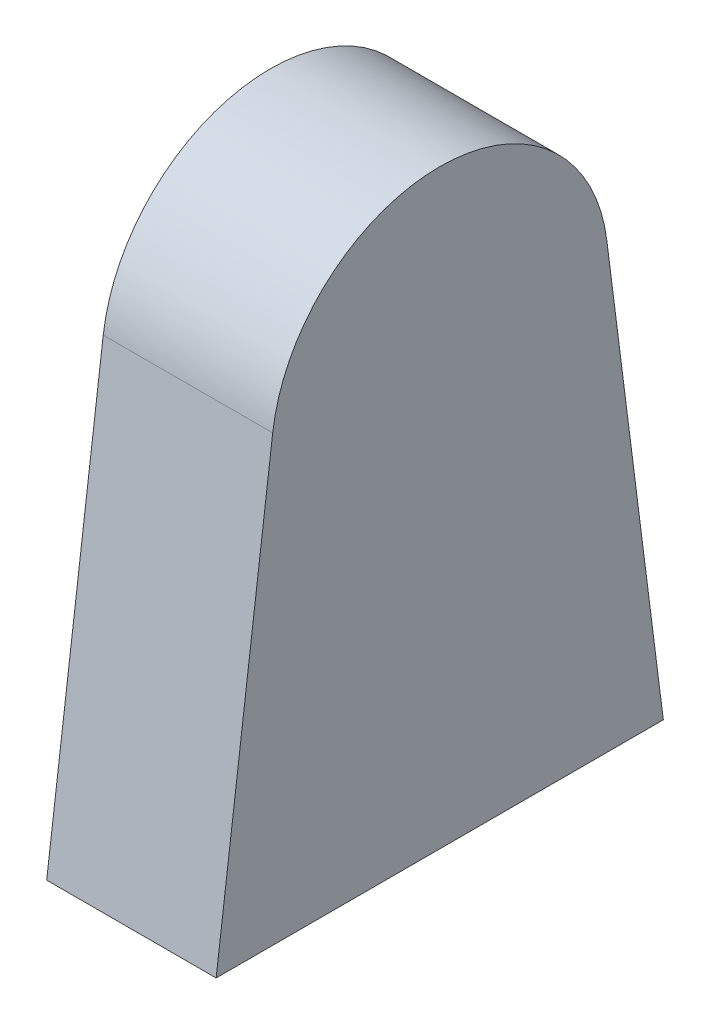
ISO-10303-21;
HEADER;
FILE_DESCRIPTION(('STEP AP214'),'2;1');
FILE_NAME('part.step','',(''),(''),'','','');
FILE_SCHEMA(('AUTOMOTIVE_DESIGN { 1 0 10303 214 1 1 1 1 }'));
ENDSEC;
DATA;
#1=APPLICATION_CONTEXT('core data for automotive mechanical design processes');
#2=APPLICATION_PROTOCOL_DEFINITION('international standard','automotive_design',2000,#1);
#3=PRODUCT_CONTEXT('',#1,'mechanical');
#4=PRODUCT('Part','Part','',(#3));
#5=PRODUCT_RELATED_PRODUCT_CATEGORY('part','',(#4));
#6=PRODUCT_DEFINITION_FORMATION('','',#4);
#7=PRODUCT_DEFINITION_CONTEXT('part definition',#1,'design');
#8=PRODUCT_DEFINITION('design','',#6,#7);
#9=PRODUCT_DEFINITION_SHAPE('','',#8);
#10=(LENGTH_UNIT() NAMED_UNIT(*) SI_UNIT(.MILLI.,.METRE.));
#11=(NAMED_UNIT(*) PLANE_ANGLE_UNIT() SI_UNIT($,.RADIAN.));
#12=(NAMED_UNIT(*) SI_UNIT($,.STERADIAN.) SOLID_ANGLE_UNIT());
#13=UNCERTAINTY_MEASURE_WITH_UNIT(LENGTH_MEASURE(1.E-05),#10,'distance_accuracy_value','');
#14=(GEOMETRIC_REPRESENTATION_CONTEXT(3) GLOBAL_UNCERTAINTY_ASSIGNED_CONTEXT((#13)) GLOBAL_UNIT_ASSIGNED_CONTEXT((#10,
#11,#12)) REPRESENTATION_CONTEXT('',''));
#15=CARTESIAN_POINT('',(0.,0.,0.));
#16=DIRECTION('',(0.,0.,1.));
#17=DIRECTION('',(1.,0.,0.));
#18=AXIS2_PLACEMENT_3D('',#15,#16,#17);
#19=CARTESIAN_POINT('',(1.,0.,-3.95808696063981));
#20=DIRECTION('',(0.,-0.126411308106956,0.991977913656694));
#21=DIRECTION('',(0.,-0.991977913656694,-0.126411308106956));
#22=AXIS2_PLACEMENT_3D('',#19,#20,#21);
#23=PLANE('',#22);
#24=DIRECTION('',(-1.,0.,0.));
#25=VECTOR('',#24,1.);
#26=CARTESIAN_POINT('',(1.,0.,-3.95808696063981));
#27=LINE('',#26,#25);
#28=CARTESIAN_POINT('',(1.5,0.,-3.95808696063981));
#29=VERTEX_POINT('',#28);
#30=CARTESIAN_POINT('',(-1.5,0.,-3.95808696063981));
#31=VERTEX_POINT('',#30);
#32=EDGE_CURVE('E11',#29,#31,#27,.T.);
#33=ORIENTED_EDGE('',*,*,#32,.T.);
#34=DIRECTION('',(0.,-0.991977913656694,-0.126411308106956));
#35=VECTOR('',#34,1.);
#36=CARTESIAN_POINT('',(-1.5,7.85592743751151,-2.95697791365669));
#37=LINE('',#36,#35);
#38=CARTESIAN_POINT('',(-1.5,7.85592743751151,-2.95697791365669));
#39=VERTEX_POINT('',#38);
#40=EDGE_CURVE('E114',#39,#31,#37,.T.);
#41=ORIENTED_EDGE('',*,*,#40,.F.);
#42=DIRECTION('',(-1.,0.,0.));
#43=VECTOR('',#42,1.);
#44=CARTESIAN_POINT('',(1.,7.85592743751151,-2.95697791365669));
#45=LINE('',#44,#43);
#46=CARTESIAN_POINT('',(1.5,7.85592743751151,-2.95697791365669));
#47=VERTEX_POINT('',#46);
#48=EDGE_CURVE('E43',#47,#39,#45,.T.);
#49=ORIENTED_EDGE('',*,*,#48,.F.);
#50=DIRECTION('',(0.,0.991977913656694,0.126411308106956));
#51=VECTOR('',#50,1.);
#52=CARTESIAN_POINT('',(1.5,0.,-3.95808696063981));
#53=LINE('',#52,#51);
#54=EDGE_CURVE('E133',#29,#47,#53,.T.);
#55=ORIENTED_EDGE('',*,*,#54,.F.);
#56=EDGE_LOOP('',(#33,#41,#49,#55));
#57=FACE_BOUND('',#56,.T.);
#58=ADVANCED_FACE('F33',(#57),#23,.F.);
#59=CARTESIAN_POINT('',(1.,7.47910912234277,0.));
#60=DIRECTION('',(-1.,0.,0.));
#61=DIRECTION('',(0.,0.,1.));
#62=AXIS2_PLACEMENT_3D('',#59,#60,#61);
#63=CYLINDRICAL_SURFACE('',#62,2.98089087765723);
#64=ORIENTED_EDGE('',*,*,#48,.T.);
#65=CARTESIAN_POINT('',(-1.5,7.47910912234277,0.));
#66=DIRECTION('',(-1.,0.,0.));
#67=DIRECTION('',(0.,0.,1.));
#68=AXIS2_PLACEMENT_3D('',#65,#66,#67);
#69=CIRCLE('',#68,2.98089087765723);
#70=CARTESIAN_POINT('',(-1.5,7.85592743751151,2.95697791365669));
#71=VERTEX_POINT('',#70);
#72=EDGE_CURVE('E109',#71,#39,#69,.T.);
#73=ORIENTED_EDGE('',*,*,#72,.F.);
#74=DIRECTION('',(-1.,0.,0.));
#75=VECTOR('',#74,1.);
#76=CARTESIAN_POINT('',(1.,7.85592743751151,2.95697791365669));
#77=LINE('',#76,#75);
#78=CARTESIAN_POINT('',(1.5,7.85592743751151,2.95697791365669));
#79=VERTEX_POINT('',#78);
#80=EDGE_CURVE('E96',#79,#71,#77,.T.);
#81=ORIENTED_EDGE('',*,*,#80,.F.);
#82=CARTESIAN_POINT('',(1.5,7.47910912234277,0.));
#83=DIRECTION('',(1.,0.,0.));
#84=DIRECTION('',(0.,0.,-1.));
#85=AXIS2_PLACEMENT_3D('',#82,#83,#84);
#86=CIRCLE('',#85,2.98089087765723);
#87=EDGE_CURVE('E136',#47,#79,#86,.T.);
#88=ORIENTED_EDGE('',*,*,#87,.F.);
#89=EDGE_LOOP('',(#64,#73,#81,#88));
#90=FACE_BOUND('',#89,.T.);
#91=ADVANCED_FACE('F110',(#90),#63,.T.);
#92=CARTESIAN_POINT('',(1.,0.,3.95808696063981));
#93=DIRECTION('',(0.,-0.126411308106956,-0.991977913656694));
#94=DIRECTION('',(0.,0.991977913656694,-0.126411308106956));
#95=AXIS2_PLACEMENT_3D('',#92,#93,#94);
#96=PLANE('',#95);
#97=ORIENTED_EDGE('',*,*,#80,.T.);
#98=DIRECTION('',(0.,0.991977913656694,-0.126411308106956));
#99=VECTOR('',#98,1.);
#100=CARTESIAN_POINT('',(-1.5,0.,3.95808696063981));
#101=LINE('',#100,#99);
#102=CARTESIAN_POINT('',(-1.5,0.,3.95808696063981));
#103=VERTEX_POINT('',#102);
#104=EDGE_CURVE('E100',#103,#71,#101,.T.);
#105=ORIENTED_EDGE('',*,*,#104,.F.);
#106=DIRECTION('',(-1.,0.,0.));
#107=VECTOR('',#106,1.);
#108=CARTESIAN_POINT('',(1.,0.,3.95808696063981));
#109=LINE('',#108,#107);
#110=CARTESIAN_POINT('',(1.5,0.,3.95808696063981));
#111=VERTEX_POINT('',#110);
#112=EDGE_CURVE('E106',#111,#103,#109,.T.);
#113=ORIENTED_EDGE('',*,*,#112,.F.);
#114=DIRECTION('',(0.,-0.991977913656694,0.126411308106956));
#115=VECTOR('',#114,1.);
#116=CARTESIAN_POINT('',(1.5,7.85592743751151,2.95697791365669));
#117=LINE('',#116,#115);
#118=EDGE_CURVE('E102',#79,#111,#117,.T.);
#119=ORIENTED_EDGE('',*,*,#118,.F.);
#120=EDGE_LOOP('',(#97,#105,#113,#119));
#121=FACE_BOUND('',#120,.T.);
#122=ADVANCED_FACE('F98',(#121),#96,.F.);
#123=CARTESIAN_POINT('',(1.,0.,2.95));
#124=DIRECTION('',(0.,1.,0.));
#125=DIRECTION('',(0.,0.,1.));
#126=AXIS2_PLACEMENT_3D('',#123,#124,#125);
#127=PLANE('',#126);
#128=DIRECTION('',(0.,0.,1.));
#129=VECTOR('',#128,1.);
#130=CARTESIAN_POINT('',(-1.5,0.,-3.95808696063981));
#131=LINE('',#130,#129);
#132=EDGE_CURVE('E119',#31,#103,#131,.T.);
#133=ORIENTED_EDGE('',*,*,#132,.F.);
#134=ORIENTED_EDGE('',*,*,#32,.F.);
#135=DIRECTION('',(0.,0.,-1.));
#136=VECTOR('',#135,1.);
#137=CARTESIAN_POINT('',(1.5,0.,2.95));
#138=LINE('',#137,#136);
#139=EDGE_CURVE('E130',#111,#29,#138,.T.);
#140=ORIENTED_EDGE('',*,*,#139,.F.);
#141=ORIENTED_EDGE('',*,*,#112,.T.);
#142=EDGE_LOOP('',(#133,#134,#140,#141));
#143=FACE_BOUND('',#142,.T.);
#144=DIRECTION('',(-1.,0.,0.));
#145=VECTOR('',#144,1.);
#146=CARTESIAN_POINT('',(1.,0.,-2.95));
#147=LINE('',#146,#145);
#148=CARTESIAN_POINT('',(1.,0.,-2.95));
#149=VERTEX_POINT('',#148);
#150=CARTESIAN_POINT('',(-1.,0.,-2.95));
#151=VERTEX_POINT('',#150);
#152=EDGE_CURVE('E156',#149,#151,#147,.T.);
#153=ORIENTED_EDGE('',*,*,#152,.T.);
#154=DIRECTION('',(0.,0.,1.));
#155=VECTOR('',#154,1.);
#156=CARTESIAN_POINT('',(-1.,0.,-3.95808696063981));
#157=LINE('',#156,#155);
#158=CARTESIAN_POINT('',(-1.,0.,2.95));
#159=VERTEX_POINT('',#158);
#160=EDGE_CURVE('E120',#151,#159,#157,.T.);
#161=ORIENTED_EDGE('',*,*,#160,.T.);
#162=DIRECTION('',(-1.,0.,0.));
#163=VECTOR('',#162,1.);
#164=CARTESIAN_POINT('',(1.,0.,2.95));
#165=LINE('',#164,#163);
#166=CARTESIAN_POINT('',(1.,0.,2.95));
#167=VERTEX_POINT('',#166);
#168=EDGE_CURVE('E159',#167,#159,#165,.T.);
#169=ORIENTED_EDGE('',*,*,#168,.F.);
#170=DIRECTION('',(0.,0.,-1.));
#171=VECTOR('',#170,1.);
#172=CARTESIAN_POINT('',(1.,0.,3.95808696063981));
#173=LINE('',#172,#171);
#174=EDGE_CURVE('E127',#167,#149,#173,.T.);
#175=ORIENTED_EDGE('',*,*,#174,.T.);
#176=EDGE_LOOP('',(#153,#161,#169,#175));
#177=FACE_BOUND('',#176,.T.);
#178=ADVANCED_FACE('F180',(#143,#177),#127,.F.);
#179=CARTESIAN_POINT('',(1.,0.,2.95));
#180=DIRECTION('',(0.,0.126411308106956,0.991977913656694));
#181=DIRECTION('',(0.,-0.991977913656694,0.126411308106956));
#182=AXIS2_PLACEMENT_3D('',#179,#180,#181);
#183=PLANE('',#182);
#184=DIRECTION('',(0.,0.991977913656694,-0.126411308106956));
#185=VECTOR('',#184,1.);
#186=CARTESIAN_POINT('',(-1.,0.,2.95));
#187=LINE('',#186,#185);
#188=CARTESIAN_POINT('',(-1.,7.72951612940455,1.965));
#189=VERTEX_POINT('',#188);
#190=EDGE_CURVE('E139',#159,#189,#187,.T.);
#191=ORIENTED_EDGE('',*,*,#190,.T.);
#192=DIRECTION('',(-1.,0.,0.));
#193=VECTOR('',#192,1.);
#194=CARTESIAN_POINT('',(1.,7.72951612940455,1.965));
#195=LINE('',#194,#193);
#196=CARTESIAN_POINT('',(1.,7.72951612940455,1.965));
#197=VERTEX_POINT('',#196);
#198=EDGE_CURVE('E162',#197,#189,#195,.T.);
#199=ORIENTED_EDGE('',*,*,#198,.F.);
#200=DIRECTION('',(0.,0.991977913656694,-0.126411308106956));
#201=VECTOR('',#200,1.);
#202=CARTESIAN_POINT('',(1.,0.,2.95));
#203=LINE('',#202,#201);
#204=EDGE_CURVE('E148',#167,#197,#203,.T.);
#205=ORIENTED_EDGE('',*,*,#204,.F.);
#206=ORIENTED_EDGE('',*,*,#168,.T.);
#207=EDGE_LOOP('',(#191,#199,#205,#206));
#208=FACE_BOUND('',#207,.T.);
#209=ADVANCED_FACE('F189',(#208),#183,.F.);
#210=CARTESIAN_POINT('',(1.,7.47910912234277,0.));
#211=DIRECTION('',(-1.,0.,0.));
#212=DIRECTION('',(0.,0.,1.));
#213=AXIS2_PLACEMENT_3D('',#210,#211,#212);
#214=CYLINDRICAL_SURFACE('',#213,1.98089087765723);
#215=CARTESIAN_POINT('',(-1.,7.47910912234277,0.));
#216=DIRECTION('',(-1.,0.,0.));
#217=DIRECTION('',(0.,0.,1.));
#218=AXIS2_PLACEMENT_3D('',#215,#216,#217);
#219=CIRCLE('',#218,1.98089087765723);
#220=CARTESIAN_POINT('',(-1.,7.72951612940455,-1.965));
#221=VERTEX_POINT('',#220);
#222=EDGE_CURVE('E151',#189,#221,#219,.T.);
#223=ORIENTED_EDGE('',*,*,#222,.T.);
#224=DIRECTION('',(-1.,0.,0.));
#225=VECTOR('',#224,1.);
#226=CARTESIAN_POINT('',(1.,7.72951612940455,-1.965));
#227=LINE('',#226,#225);
#228=CARTESIAN_POINT('',(1.,7.72951612940455,-1.965));
#229=VERTEX_POINT('',#228);
#230=EDGE_CURVE('E51',#229,#221,#227,.T.);
#231=ORIENTED_EDGE('',*,*,#230,.F.);
#232=CARTESIAN_POINT('',(1.,7.47910912234277,0.));
#233=DIRECTION('',(-1.,0.,0.));
#234=DIRECTION('',(0.,0.,1.));
#235=AXIS2_PLACEMENT_3D('',#232,#233,#234);
#236=CIRCLE('',#235,1.98089087765723);
#237=EDGE_CURVE('E144',#197,#229,#236,.T.);
#238=ORIENTED_EDGE('',*,*,#237,.F.);
#239=ORIENTED_EDGE('',*,*,#198,.T.);
#240=EDGE_LOOP('',(#223,#231,#238,#239));
#241=FACE_BOUND('',#240,.T.);
#242=ADVANCED_FACE('F187',(#241),#214,.F.);
#243=CARTESIAN_POINT('',(1.,0.,-2.95));
#244=DIRECTION('',(0.,0.126411308106956,-0.991977913656694));
#245=DIRECTION('',(0.,0.991977913656694,0.126411308106956));
#246=AXIS2_PLACEMENT_3D('',#243,#244,#245);
#247=PLANE('',#246);
#248=DIRECTION('',(0.,-0.991977913656694,-0.126411308106956));
#249=VECTOR('',#248,1.);
#250=CARTESIAN_POINT('',(-1.,0.,-2.95));
#251=LINE('',#250,#249);
#252=EDGE_CURVE('E36',#221,#151,#251,.T.);
#253=ORIENTED_EDGE('',*,*,#252,.T.);
#254=ORIENTED_EDGE('',*,*,#152,.F.);
#255=DIRECTION('',(0.,-0.991977913656694,-0.126411308106956));
#256=VECTOR('',#255,1.);
#257=CARTESIAN_POINT('',(1.,0.,-2.95));
#258=LINE('',#257,#256);
#259=EDGE_CURVE('E147',#229,#149,#258,.T.);
#260=ORIENTED_EDGE('',*,*,#259,.F.);
#261=ORIENTED_EDGE('',*,*,#230,.T.);
#262=EDGE_LOOP('',(#253,#254,#260,#261));
#263=FACE_BOUND('',#262,.T.);
#264=ADVANCED_FACE('F177',(#263),#247,.F.);
#265=CARTESIAN_POINT('',(1.,7.47910912234277,0.));
#266=DIRECTION('',(1.,0.,0.));
#267=DIRECTION('',(0.,0.,-1.));
#268=AXIS2_PLACEMENT_3D('',#265,#266,#267);
#269=PLANE('',#268);
#270=ORIENTED_EDGE('',*,*,#174,.F.);
#271=ORIENTED_EDGE('',*,*,#204,.T.);
#272=ORIENTED_EDGE('',*,*,#237,.T.);
#273=ORIENTED_EDGE('',*,*,#259,.T.);
#274=EDGE_LOOP('',(#270,#271,#272,#273));
#275=FACE_BOUND('',#274,.T.);
#276=ADVANCED_FACE('F191',(#275),#269,.F.);
#277=CARTESIAN_POINT('',(1.5,7.47910912234277,0.));
#278=DIRECTION('',(1.,0.,0.));
#279=DIRECTION('',(0.,0.,-1.));
#280=AXIS2_PLACEMENT_3D('',#277,#278,#279);
#281=PLANE('',#280);
#282=ORIENTED_EDGE('',*,*,#139,.T.);
#283=ORIENTED_EDGE('',*,*,#54,.T.);
#284=ORIENTED_EDGE('',*,*,#87,.T.);
#285=ORIENTED_EDGE('',*,*,#118,.T.);
#286=EDGE_LOOP('',(#282,#283,#284,#285));
#287=FACE_BOUND('',#286,.T.);
#288=ADVANCED_FACE('F193',(#287),#281,.T.);
#289=CARTESIAN_POINT('',(-1.5,7.47910912234277,0.));
#290=DIRECTION('',(-1.,0.,0.));
#291=DIRECTION('',(0.,0.,1.));
#292=AXIS2_PLACEMENT_3D('',#289,#290,#291);
#293=PLANE('',#292);
#294=ORIENTED_EDGE('',*,*,#104,.T.);
#295=ORIENTED_EDGE('',*,*,#72,.T.);
#296=ORIENTED_EDGE('',*,*,#40,.T.);
#297=ORIENTED_EDGE('',*,*,#132,.T.);
#298=EDGE_LOOP('',(#294,#295,#296,#297));
#299=FACE_BOUND('',#298,.T.);
#300=ADVANCED_FACE('F117',(#299),#293,.T.);
#301=CARTESIAN_POINT('',(-1.,7.47910912234277,0.));
#302=DIRECTION('',(-1.,0.,0.));
#303=DIRECTION('',(0.,0.,1.));
#304=AXIS2_PLACEMENT_3D('',#301,#302,#303);
#305=PLANE('',#304);
#306=ORIENTED_EDGE('',*,*,#252,.F.);
#307=ORIENTED_EDGE('',*,*,#222,.F.);
#308=ORIENTED_EDGE('',*,*,#190,.F.);
#309=ORIENTED_EDGE('',*,*,#160,.F.);
#310=EDGE_LOOP('',(#306,#307,#308,#309));
#311=FACE_BOUND('',#310,.T.);
#312=ADVANCED_FACE('F238',(#311),#305,.F.);
#313=CLOSED_SHELL('',(#58,#91,#122,#178,#209,#242,#264,#276,#288,#300,#312));
#314=MANIFOLD_SOLID_BREP('B2',#313);
#315=ADVANCED_BREP_SHAPE_REPRESENTATION('',(#18,#314),#14);
#316=SHAPE_DEFINITION_REPRESENTATION(#9,#315);
ENDSEC;
END-ISO-10303-21;
